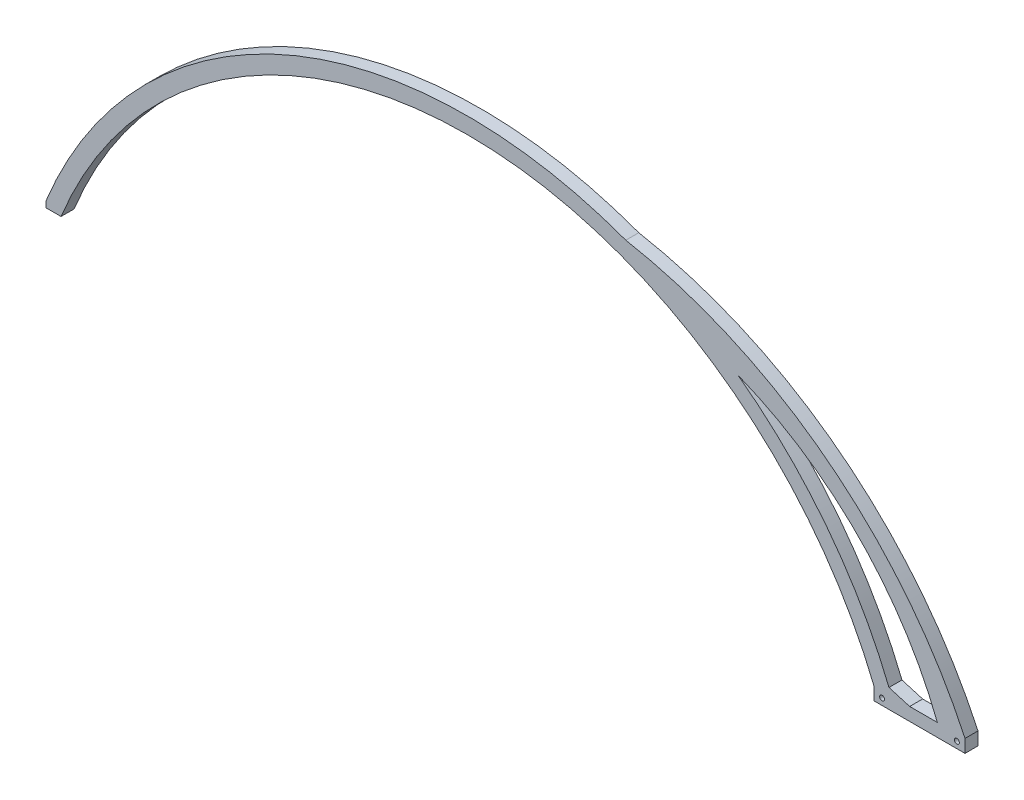
ISO-10303-21;
HEADER;
FILE_DESCRIPTION(('STEP AP214'),'2;1');
FILE_NAME('part.step','',(''),(''),'','','');
FILE_SCHEMA(('AUTOMOTIVE_DESIGN { 1 0 10303 214 1 1 1 1 }'));
ENDSEC;
DATA;
#1=APPLICATION_CONTEXT('core data for automotive mechanical design processes');
#2=APPLICATION_PROTOCOL_DEFINITION('international standard','automotive_design',2000,#1);
#3=PRODUCT_CONTEXT('',#1,'mechanical');
#4=PRODUCT('Part','Part','',(#3));
#5=PRODUCT_RELATED_PRODUCT_CATEGORY('part','',(#4));
#6=PRODUCT_DEFINITION_FORMATION('','',#4);
#7=PRODUCT_DEFINITION_CONTEXT('part definition',#1,'design');
#8=PRODUCT_DEFINITION('design','',#6,#7);
#9=PRODUCT_DEFINITION_SHAPE('','',#8);
#10=(LENGTH_UNIT() NAMED_UNIT(*) SI_UNIT(.MILLI.,.METRE.));
#11=(NAMED_UNIT(*) PLANE_ANGLE_UNIT() SI_UNIT($,.RADIAN.));
#12=(NAMED_UNIT(*) SI_UNIT($,.STERADIAN.) SOLID_ANGLE_UNIT());
#13=UNCERTAINTY_MEASURE_WITH_UNIT(LENGTH_MEASURE(1.E-05),#10,'distance_accuracy_value','');
#14=(GEOMETRIC_REPRESENTATION_CONTEXT(3) GLOBAL_UNCERTAINTY_ASSIGNED_CONTEXT((#13)) GLOBAL_UNIT_ASSIGNED_CONTEXT((#10,
#11,#12)) REPRESENTATION_CONTEXT('',''));
#15=CARTESIAN_POINT('',(0.,0.,0.));
#16=DIRECTION('',(0.,0.,1.));
#17=DIRECTION('',(1.,0.,0.));
#18=AXIS2_PLACEMENT_3D('',#15,#16,#17);
#19=CARTESIAN_POINT('',(-250.320675471821,-101.190708226255,8.));
#20=DIRECTION('',(0.,0.,-1.));
#21=DIRECTION('',(-1.,0.,0.));
#22=AXIS2_PLACEMENT_3D('',#19,#20,#21);
#23=CYLINDRICAL_SURFACE('',#22,280.);
#24=DIRECTION('',(0.,0.,-1.));
#25=VECTOR('',#24,1.);
#26=CARTESIAN_POINT('',(-152.8082424928,161.280862452384,8.));
#27=LINE('',#26,#25);
#28=CARTESIAN_POINT('',(-152.8082424928,161.280862452384,8.));
#29=VERTEX_POINT('',#28);
#30=CARTESIAN_POINT('',(-152.8082424928,161.280862452384,0.));
#31=VERTEX_POINT('',#30);
#32=EDGE_CURVE('E164',#29,#31,#27,.T.);
#33=ORIENTED_EDGE('',*,*,#32,.T.);
#34=CARTESIAN_POINT('',(-250.320675471821,-101.190708226255,0.));
#35=DIRECTION('',(0.,0.,1.));
#36=DIRECTION('',(1.,0.,0.));
#37=AXIS2_PLACEMENT_3D('',#34,#35,#36);
#38=CIRCLE('',#37,280.);
#39=CARTESIAN_POINT('',(-509.912487072229,3.74780400837979,0.));
#40=VERTEX_POINT('',#39);
#41=EDGE_CURVE('E190',#31,#40,#38,.T.);
#42=ORIENTED_EDGE('',*,*,#41,.T.);
#43=DIRECTION('',(0.,0.,-1.));
#44=VECTOR('',#43,1.);
#45=CARTESIAN_POINT('',(-509.912487072229,3.74780400837979,8.));
#46=LINE('',#45,#44);
#47=CARTESIAN_POINT('',(-509.912487072229,3.74780400837979,8.));
#48=VERTEX_POINT('',#47);
#49=EDGE_CURVE('E203',#48,#40,#46,.T.);
#50=ORIENTED_EDGE('',*,*,#49,.F.);
#51=CARTESIAN_POINT('',(-250.320675471821,-101.190708226255,8.));
#52=DIRECTION('',(0.,0.,1.));
#53=DIRECTION('',(1.,0.,0.));
#54=AXIS2_PLACEMENT_3D('',#51,#52,#53);
#55=CIRCLE('',#54,280.);
#56=EDGE_CURVE('E66',#29,#48,#55,.T.);
#57=ORIENTED_EDGE('',*,*,#56,.F.);
#58=EDGE_LOOP('',(#33,#42,#50,#57));
#59=FACE_BOUND('',#58,.T.);
#60=ADVANCED_FACE('F43',(#59),#23,.T.);
#61=CARTESIAN_POINT('',(0.,0.,8.));
#62=DIRECTION('',(0.,0.,1.));
#63=DIRECTION('',(1.,0.,0.));
#64=AXIS2_PLACEMENT_3D('',#61,#62,#63);
#65=PLANE('',#64);
#66=CARTESIAN_POINT('',(-164.11319804853,-78.6214805419995,8.));
#67=DIRECTION('',(0.,0.,-1.));
#68=DIRECTION('',(-1.,0.,0.));
#69=AXIS2_PLACEMENT_3D('',#66,#67,#68);
#70=CIRCLE('',#69,217.852205035375);
#71=CARTESIAN_POINT('',(39.0572871016484,0.,8.));
#72=VERTEX_POINT('',#71);
#73=CARTESIAN_POINT('',(-83.7272781128543,123.857375427877,8.));
#74=VERTEX_POINT('',#73);
#75=EDGE_CURVE('E159',#72,#74,#70,.F.);
#76=ORIENTED_EDGE('',*,*,#75,.F.);
#77=DIRECTION('',(-1.,0.,0.));
#78=VECTOR('',#77,1.);
#79=CARTESIAN_POINT('',(0.,0.,8.));
#80=LINE('',#79,#78);
#81=CARTESIAN_POINT('',(22.0145742032969,0.,8.));
#82=VERTEX_POINT('',#81);
#83=EDGE_CURVE('E58',#72,#82,#80,.T.);
#84=ORIENTED_EDGE('',*,*,#83,.T.);
#85=DIRECTION('',(0.959370922564464,-0.282147891960598,0.));
#86=VECTOR('',#85,1.);
#87=CARTESIAN_POINT('',(9.27113612858599,3.74780400837978,8.));
#88=LINE('',#87,#86);
#89=CARTESIAN_POINT('',(9.27113612858599,3.74780400837978,8.));
#90=VERTEX_POINT('',#89);
#91=EDGE_CURVE('E178',#90,#82,#88,.T.);
#92=ORIENTED_EDGE('',*,*,#91,.F.);
#93=EDGE_CURVE('E175',#90,#74,#55,.T.);
#94=ORIENTED_EDGE('',*,*,#93,.T.);
#95=EDGE_LOOP('',(#76,#84,#92,#94));
#96=FACE_BOUND('',#95,.T.);
#97=CARTESIAN_POINT('',(5.,-4.,8.));
#98=DIRECTION('',(0.,0.,1.));
#99=DIRECTION('',(1.,0.,0.));
#100=AXIS2_PLACEMENT_3D('',#97,#98,#99);
#101=CIRCLE('',#100,1.5);
#102=CARTESIAN_POINT('',(6.5,-4.,8.));
#103=VERTEX_POINT('',#102);
#104=EDGE_CURVE('E213',#103,#103,#101,.T.);
#105=ORIENTED_EDGE('',*,*,#104,.F.);
#106=EDGE_LOOP('',(#105));
#107=FACE_BOUND('',#106,.T.);
#108=DIRECTION('',(0.,-1.,0.));
#109=VECTOR('',#108,1.);
#110=CARTESIAN_POINT('',(0.,0.,8.));
#111=LINE('',#110,#109);
#112=CARTESIAN_POINT('',(0.,0.,8.));
#113=VERTEX_POINT('',#112);
#114=CARTESIAN_POINT('',(0.,-8.,8.));
#115=VERTEX_POINT('',#114);
#116=EDGE_CURVE('E143',#113,#115,#111,.T.);
#117=ORIENTED_EDGE('',*,*,#116,.T.);
#118=DIRECTION('',(1.,0.,0.));
#119=VECTOR('',#118,1.);
#120=CARTESIAN_POINT('',(0.,-8.,8.));
#121=LINE('',#120,#119);
#122=CARTESIAN_POINT('',(56.1,-8.00000000000001,8.));
#123=VERTEX_POINT('',#122);
#124=EDGE_CURVE('E221',#115,#123,#121,.T.);
#125=ORIENTED_EDGE('',*,*,#124,.T.);
#126=DIRECTION('',(0.,1.,0.));
#127=VECTOR('',#126,1.);
#128=CARTESIAN_POINT('',(56.1,0.,8.));
#129=LINE('',#128,#127);
#130=CARTESIAN_POINT('',(56.1,0.,8.));
#131=VERTEX_POINT('',#130);
#132=EDGE_CURVE('E223',#123,#131,#129,.T.);
#133=ORIENTED_EDGE('',*,*,#132,.T.);
#134=CARTESIAN_POINT('',(-204.446472337258,-121.547095781779,8.));
#135=DIRECTION('',(0.,0.,-1.));
#136=DIRECTION('',(-1.,0.,0.));
#137=AXIS2_PLACEMENT_3D('',#134,#135,#136);
#138=CIRCLE('',#137,287.503323007534);
#139=EDGE_CURVE('E152',#131,#29,#138,.F.);
#140=ORIENTED_EDGE('',*,*,#139,.T.);
#141=ORIENTED_EDGE('',*,*,#56,.T.);
#142=DIRECTION('',(0.,1.,0.));
#143=VECTOR('',#142,1.);
#144=CARTESIAN_POINT('',(-509.912487072229,0.,8.));
#145=LINE('',#144,#143);
#146=CARTESIAN_POINT('',(-509.912487072229,0.,8.));
#147=VERTEX_POINT('',#146);
#148=EDGE_CURVE('E171',#147,#48,#145,.T.);
#149=ORIENTED_EDGE('',*,*,#148,.F.);
#150=DIRECTION('',(-1.,0.,0.));
#151=VECTOR('',#150,1.);
#152=CARTESIAN_POINT('',(-500.641350943643,0.,8.));
#153=LINE('',#152,#151);
#154=CARTESIAN_POINT('',(-500.641350943643,0.,8.));
#155=VERTEX_POINT('',#154);
#156=EDGE_CURVE('E168',#155,#147,#153,.T.);
#157=ORIENTED_EDGE('',*,*,#156,.F.);
#158=CARTESIAN_POINT('',(-250.320675471821,-101.190708226255,8.));
#159=DIRECTION('',(0.,0.,1.));
#160=DIRECTION('',(1.,0.,0.));
#161=AXIS2_PLACEMENT_3D('',#158,#159,#160);
#162=CIRCLE('',#161,270.);
#163=EDGE_CURVE('E181',#113,#155,#162,.T.);
#164=ORIENTED_EDGE('',*,*,#163,.F.);
#165=EDGE_LOOP('',(#117,#125,#133,#140,#141,#149,#157,#164));
#166=FACE_BOUND('',#165,.T.);
#167=CARTESIAN_POINT('',(51.1,-3.99999999999999,8.));
#168=DIRECTION('',(0.,0.,1.));
#169=DIRECTION('',(-1.,0.,0.));
#170=AXIS2_PLACEMENT_3D('',#167,#168,#169);
#171=CIRCLE('',#170,1.5);
#172=CARTESIAN_POINT('',(49.6,-3.99999999999999,8.));
#173=VERTEX_POINT('',#172);
#174=EDGE_CURVE('E207',#173,#173,#171,.T.);
#175=ORIENTED_EDGE('',*,*,#174,.F.);
#176=EDGE_LOOP('',(#175));
#177=FACE_BOUND('',#176,.T.);
#178=ADVANCED_FACE('F252',(#96,#107,#166,#177),#65,.T.);
#179=CARTESIAN_POINT('',(0.,0.,0.));
#180=DIRECTION('',(0.,0.,1.));
#181=DIRECTION('',(1.,0.,0.));
#182=AXIS2_PLACEMENT_3D('',#179,#180,#181);
#183=PLANE('',#182);
#184=DIRECTION('',(-1.,0.,0.));
#185=VECTOR('',#184,1.);
#186=CARTESIAN_POINT('',(0.,0.,0.));
#187=LINE('',#186,#185);
#188=CARTESIAN_POINT('',(39.0572871016484,0.,0.));
#189=VERTEX_POINT('',#188);
#190=CARTESIAN_POINT('',(22.0145742032969,0.,0.));
#191=VERTEX_POINT('',#190);
#192=EDGE_CURVE('E134',#189,#191,#187,.T.);
#193=ORIENTED_EDGE('',*,*,#192,.F.);
#194=CARTESIAN_POINT('',(-164.11319804853,-78.6214805419995,0.));
#195=DIRECTION('',(0.,0.,-1.));
#196=DIRECTION('',(-1.,0.,0.));
#197=AXIS2_PLACEMENT_3D('',#194,#195,#196);
#198=CIRCLE('',#197,217.852205035375);
#199=CARTESIAN_POINT('',(-83.7272781128543,123.857375427877,0.));
#200=VERTEX_POINT('',#199);
#201=EDGE_CURVE('E139',#189,#200,#198,.F.);
#202=ORIENTED_EDGE('',*,*,#201,.T.);
#203=CARTESIAN_POINT('',(9.27113612858599,3.74780400837978,0.));
#204=VERTEX_POINT('',#203);
#205=EDGE_CURVE('E191',#204,#200,#38,.T.);
#206=ORIENTED_EDGE('',*,*,#205,.F.);
#207=DIRECTION('',(0.959370922564464,-0.282147891960598,0.));
#208=VECTOR('',#207,1.);
#209=CARTESIAN_POINT('',(9.27113612858599,3.74780400837978,0.));
#210=LINE('',#209,#208);
#211=EDGE_CURVE('E141',#204,#191,#210,.T.);
#212=ORIENTED_EDGE('',*,*,#211,.T.);
#213=EDGE_LOOP('',(#193,#202,#206,#212));
#214=FACE_BOUND('',#213,.T.);
#215=DIRECTION('',(0.,-1.,0.));
#216=VECTOR('',#215,1.);
#217=CARTESIAN_POINT('',(0.,0.,0.));
#218=LINE('',#217,#216);
#219=CARTESIAN_POINT('',(0.,0.,0.));
#220=VERTEX_POINT('',#219);
#221=CARTESIAN_POINT('',(0.,-8.,0.));
#222=VERTEX_POINT('',#221);
#223=EDGE_CURVE('E216',#220,#222,#218,.T.);
#224=ORIENTED_EDGE('',*,*,#223,.F.);
#225=CARTESIAN_POINT('',(-250.320675471821,-101.190708226255,0.));
#226=DIRECTION('',(0.,0.,1.));
#227=DIRECTION('',(1.,0.,0.));
#228=AXIS2_PLACEMENT_3D('',#225,#226,#227);
#229=CIRCLE('',#228,270.);
#230=CARTESIAN_POINT('',(-500.641350943643,0.,0.));
#231=VERTEX_POINT('',#230);
#232=EDGE_CURVE('E172',#220,#231,#229,.T.);
#233=ORIENTED_EDGE('',*,*,#232,.T.);
#234=DIRECTION('',(-1.,0.,0.));
#235=VECTOR('',#234,1.);
#236=CARTESIAN_POINT('',(-500.641350943643,0.,0.));
#237=LINE('',#236,#235);
#238=CARTESIAN_POINT('',(-509.912487072229,0.,0.));
#239=VERTEX_POINT('',#238);
#240=EDGE_CURVE('E166',#231,#239,#237,.T.);
#241=ORIENTED_EDGE('',*,*,#240,.T.);
#242=DIRECTION('',(0.,1.,0.));
#243=VECTOR('',#242,1.);
#244=CARTESIAN_POINT('',(-509.912487072229,0.,0.));
#245=LINE('',#244,#243);
#246=EDGE_CURVE('E187',#239,#40,#245,.T.);
#247=ORIENTED_EDGE('',*,*,#246,.T.);
#248=ORIENTED_EDGE('',*,*,#41,.F.);
#249=CARTESIAN_POINT('',(-204.446472337258,-121.547095781779,0.));
#250=DIRECTION('',(0.,0.,-1.));
#251=DIRECTION('',(-1.,0.,0.));
#252=AXIS2_PLACEMENT_3D('',#249,#250,#251);
#253=CIRCLE('',#252,287.503323007534);
#254=CARTESIAN_POINT('',(56.1,0.,0.));
#255=VERTEX_POINT('',#254);
#256=EDGE_CURVE('E156',#255,#31,#253,.F.);
#257=ORIENTED_EDGE('',*,*,#256,.F.);
#258=DIRECTION('',(0.,1.,0.));
#259=VECTOR('',#258,1.);
#260=CARTESIAN_POINT('',(56.1,0.,0.));
#261=LINE('',#260,#259);
#262=CARTESIAN_POINT('',(56.1,-8.00000000000001,0.));
#263=VERTEX_POINT('',#262);
#264=EDGE_CURVE('E144',#263,#255,#261,.T.);
#265=ORIENTED_EDGE('',*,*,#264,.F.);
#266=DIRECTION('',(1.,0.,0.));
#267=VECTOR('',#266,1.);
#268=CARTESIAN_POINT('',(0.,-8.,0.));
#269=LINE('',#268,#267);
#270=EDGE_CURVE('E229',#222,#263,#269,.T.);
#271=ORIENTED_EDGE('',*,*,#270,.F.);
#272=EDGE_LOOP('',(#224,#233,#241,#247,#248,#257,#265,#271));
#273=FACE_BOUND('',#272,.T.);
#274=CARTESIAN_POINT('',(5.,-4.,0.));
#275=DIRECTION('',(0.,0.,1.));
#276=DIRECTION('',(1.,0.,0.));
#277=AXIS2_PLACEMENT_3D('',#274,#275,#276);
#278=CIRCLE('',#277,1.5);
#279=CARTESIAN_POINT('',(6.5,-4.,0.));
#280=VERTEX_POINT('',#279);
#281=EDGE_CURVE('E210',#280,#280,#278,.T.);
#282=ORIENTED_EDGE('',*,*,#281,.T.);
#283=EDGE_LOOP('',(#282));
#284=FACE_BOUND('',#283,.T.);
#285=CARTESIAN_POINT('',(51.1,-3.99999999999999,0.));
#286=DIRECTION('',(0.,0.,1.));
#287=DIRECTION('',(-1.,0.,0.));
#288=AXIS2_PLACEMENT_3D('',#285,#286,#287);
#289=CIRCLE('',#288,1.5);
#290=CARTESIAN_POINT('',(49.6,-3.99999999999999,0.));
#291=VERTEX_POINT('',#290);
#292=EDGE_CURVE('E198',#291,#291,#289,.T.);
#293=ORIENTED_EDGE('',*,*,#292,.T.);
#294=EDGE_LOOP('',(#293));
#295=FACE_BOUND('',#294,.T.);
#296=ADVANCED_FACE('F135',(#214,#273,#284,#295),#183,.F.);
#297=CARTESIAN_POINT('',(0.,0.,8.));
#298=DIRECTION('',(1.,0.,0.));
#299=DIRECTION('',(0.,1.,0.));
#300=AXIS2_PLACEMENT_3D('',#297,#298,#299);
#301=PLANE('',#300);
#302=ORIENTED_EDGE('',*,*,#223,.T.);
#303=DIRECTION('',(0.,0.,-1.));
#304=VECTOR('',#303,1.);
#305=CARTESIAN_POINT('',(0.,-8.,8.));
#306=LINE('',#305,#304);
#307=EDGE_CURVE('E11',#115,#222,#306,.T.);
#308=ORIENTED_EDGE('',*,*,#307,.F.);
#309=ORIENTED_EDGE('',*,*,#116,.F.);
#310=DIRECTION('',(0.,0.,-1.));
#311=VECTOR('',#310,1.);
#312=CARTESIAN_POINT('',(0.,0.,8.));
#313=LINE('',#312,#311);
#314=EDGE_CURVE('E226',#113,#220,#313,.T.);
#315=ORIENTED_EDGE('',*,*,#314,.T.);
#316=EDGE_LOOP('',(#302,#308,#309,#315));
#317=FACE_BOUND('',#316,.T.);
#318=ADVANCED_FACE('F45',(#317),#301,.F.);
#319=CARTESIAN_POINT('',(0.,-8.,8.));
#320=DIRECTION('',(0.,1.,0.));
#321=DIRECTION('',(-1.,0.,0.));
#322=AXIS2_PLACEMENT_3D('',#319,#320,#321);
#323=PLANE('',#322);
#324=ORIENTED_EDGE('',*,*,#270,.T.);
#325=DIRECTION('',(0.,0.,-1.));
#326=VECTOR('',#325,1.);
#327=CARTESIAN_POINT('',(56.1,-8.00000000000001,8.));
#328=LINE('',#327,#326);
#329=EDGE_CURVE('E51',#123,#263,#328,.T.);
#330=ORIENTED_EDGE('',*,*,#329,.F.);
#331=ORIENTED_EDGE('',*,*,#124,.F.);
#332=ORIENTED_EDGE('',*,*,#307,.T.);
#333=EDGE_LOOP('',(#324,#330,#331,#332));
#334=FACE_BOUND('',#333,.T.);
#335=ADVANCED_FACE('F297',(#334),#323,.F.);
#336=CARTESIAN_POINT('',(56.1,0.,8.));
#337=DIRECTION('',(-1.,0.,0.));
#338=DIRECTION('',(0.,0.,1.));
#339=AXIS2_PLACEMENT_3D('',#336,#337,#338);
#340=PLANE('',#339);
#341=ORIENTED_EDGE('',*,*,#264,.T.);
#342=DIRECTION('',(0.,0.,-1.));
#343=VECTOR('',#342,1.);
#344=CARTESIAN_POINT('',(56.1,0.,8.));
#345=LINE('',#344,#343);
#346=EDGE_CURVE('E234',#131,#255,#345,.T.);
#347=ORIENTED_EDGE('',*,*,#346,.F.);
#348=ORIENTED_EDGE('',*,*,#132,.F.);
#349=ORIENTED_EDGE('',*,*,#329,.T.);
#350=EDGE_LOOP('',(#341,#347,#348,#349));
#351=FACE_BOUND('',#350,.T.);
#352=ADVANCED_FACE('F241',(#351),#340,.F.);
#353=CARTESIAN_POINT('',(0.,0.,8.));
#354=DIRECTION('',(0.,-1.,0.));
#355=DIRECTION('',(1.,0.,0.));
#356=AXIS2_PLACEMENT_3D('',#353,#354,#355);
#357=PLANE('',#356);
#358=ORIENTED_EDGE('',*,*,#83,.F.);
#359=DIRECTION('',(0.,0.,-1.));
#360=VECTOR('',#359,1.);
#361=CARTESIAN_POINT('',(39.0572871016484,0.,8.));
#362=LINE('',#361,#360);
#363=EDGE_CURVE('E146',#72,#189,#362,.T.);
#364=ORIENTED_EDGE('',*,*,#363,.T.);
#365=ORIENTED_EDGE('',*,*,#192,.T.);
#366=DIRECTION('',(0.,0.,-1.));
#367=VECTOR('',#366,1.);
#368=CARTESIAN_POINT('',(22.0145742032969,0.,8.));
#369=LINE('',#368,#367);
#370=EDGE_CURVE('E199',#82,#191,#369,.T.);
#371=ORIENTED_EDGE('',*,*,#370,.F.);
#372=EDGE_LOOP('',(#358,#364,#365,#371));
#373=FACE_BOUND('',#372,.T.);
#374=ADVANCED_FACE('F147',(#373),#357,.F.);
#375=CARTESIAN_POINT('',(5.,-4.,8.));
#376=DIRECTION('',(0.,0.,-1.));
#377=DIRECTION('',(-1.,0.,0.));
#378=AXIS2_PLACEMENT_3D('',#375,#376,#377);
#379=CYLINDRICAL_SURFACE('',#378,1.5);
#380=ORIENTED_EDGE('',*,*,#104,.T.);
#381=EDGE_LOOP('',(#380));
#382=FACE_BOUND('',#381,.T.);
#383=ORIENTED_EDGE('',*,*,#281,.F.);
#384=EDGE_LOOP('',(#383));
#385=FACE_BOUND('',#384,.T.);
#386=ADVANCED_FACE('F287',(#382,#385),#379,.F.);
#387=CARTESIAN_POINT('',(51.1,-3.99999999999999,8.));
#388=DIRECTION('',(0.,0.,-1.));
#389=DIRECTION('',(-1.,0.,0.));
#390=AXIS2_PLACEMENT_3D('',#387,#388,#389);
#391=CYLINDRICAL_SURFACE('',#390,1.5);
#392=ORIENTED_EDGE('',*,*,#174,.T.);
#393=EDGE_LOOP('',(#392));
#394=FACE_BOUND('',#393,.T.);
#395=ORIENTED_EDGE('',*,*,#292,.F.);
#396=EDGE_LOOP('',(#395));
#397=FACE_BOUND('',#396,.T.);
#398=ADVANCED_FACE('F283',(#394,#397),#391,.F.);
#399=CARTESIAN_POINT('',(-500.641350943643,0.,8.));
#400=DIRECTION('',(0.,-1.,0.));
#401=DIRECTION('',(1.,0.,0.));
#402=AXIS2_PLACEMENT_3D('',#399,#400,#401);
#403=PLANE('',#402);
#404=ORIENTED_EDGE('',*,*,#240,.F.);
#405=DIRECTION('',(0.,0.,-1.));
#406=VECTOR('',#405,1.);
#407=CARTESIAN_POINT('',(-500.641350943643,0.,8.));
#408=LINE('',#407,#406);
#409=EDGE_CURVE('E196',#155,#231,#408,.T.);
#410=ORIENTED_EDGE('',*,*,#409,.F.);
#411=ORIENTED_EDGE('',*,*,#156,.T.);
#412=DIRECTION('',(0.,0.,-1.));
#413=VECTOR('',#412,1.);
#414=CARTESIAN_POINT('',(-509.912487072229,0.,8.));
#415=LINE('',#414,#413);
#416=EDGE_CURVE('E184',#147,#239,#415,.T.);
#417=ORIENTED_EDGE('',*,*,#416,.T.);
#418=EDGE_LOOP('',(#404,#410,#411,#417));
#419=FACE_BOUND('',#418,.T.);
#420=ADVANCED_FACE('F270',(#419),#403,.T.);
#421=CARTESIAN_POINT('',(-250.320675471821,-101.190708226255,8.));
#422=DIRECTION('',(0.,0.,-1.));
#423=DIRECTION('',(-1.,0.,0.));
#424=AXIS2_PLACEMENT_3D('',#421,#422,#423);
#425=CYLINDRICAL_SURFACE('',#424,270.);
#426=ORIENTED_EDGE('',*,*,#232,.F.);
#427=ORIENTED_EDGE('',*,*,#314,.F.);
#428=ORIENTED_EDGE('',*,*,#163,.T.);
#429=ORIENTED_EDGE('',*,*,#409,.T.);
#430=EDGE_LOOP('',(#426,#427,#428,#429));
#431=FACE_BOUND('',#430,.T.);
#432=ADVANCED_FACE('F261',(#431),#425,.F.);
#433=CARTESIAN_POINT('',(9.27113612858599,3.74780400837978,8.));
#434=DIRECTION('',(0.282147891960598,0.959370922564464,0.));
#435=DIRECTION('',(-0.959370922564464,0.282147891960598,0.));
#436=AXIS2_PLACEMENT_3D('',#433,#434,#435);
#437=PLANE('',#436);
#438=ORIENTED_EDGE('',*,*,#211,.F.);
#439=DIRECTION('',(0.,0.,-1.));
#440=VECTOR('',#439,1.);
#441=CARTESIAN_POINT('',(9.27113612858599,3.74780400837978,8.));
#442=LINE('',#441,#440);
#443=EDGE_CURVE('E201',#90,#204,#442,.T.);
#444=ORIENTED_EDGE('',*,*,#443,.F.);
#445=ORIENTED_EDGE('',*,*,#91,.T.);
#446=ORIENTED_EDGE('',*,*,#370,.T.);
#447=EDGE_LOOP('',(#438,#444,#445,#446));
#448=FACE_BOUND('',#447,.T.);
#449=ADVANCED_FACE('F259',(#448),#437,.T.);
#450=ORIENTED_EDGE('',*,*,#205,.T.);
#451=DIRECTION('',(0.,0.,-1.));
#452=VECTOR('',#451,1.);
#453=CARTESIAN_POINT('',(-83.7272781128543,123.857375427877,8.));
#454=LINE('',#453,#452);
#455=EDGE_CURVE('E151',#74,#200,#454,.T.);
#456=ORIENTED_EDGE('',*,*,#455,.F.);
#457=ORIENTED_EDGE('',*,*,#93,.F.);
#458=ORIENTED_EDGE('',*,*,#443,.T.);
#459=EDGE_LOOP('',(#450,#456,#457,#458));
#460=FACE_BOUND('',#459,.T.);
#461=ADVANCED_FACE('F257',(#460),#23,.T.);
#462=CARTESIAN_POINT('',(-509.912487072229,0.,8.));
#463=DIRECTION('',(-1.,0.,0.));
#464=DIRECTION('',(0.,0.,1.));
#465=AXIS2_PLACEMENT_3D('',#462,#463,#464);
#466=PLANE('',#465);
#467=ORIENTED_EDGE('',*,*,#246,.F.);
#468=ORIENTED_EDGE('',*,*,#416,.F.);
#469=ORIENTED_EDGE('',*,*,#148,.T.);
#470=ORIENTED_EDGE('',*,*,#49,.T.);
#471=EDGE_LOOP('',(#467,#468,#469,#470));
#472=FACE_BOUND('',#471,.T.);
#473=ADVANCED_FACE('F268',(#472),#466,.T.);
#474=CARTESIAN_POINT('',(-204.446472337258,-121.547095781779,8.));
#475=DIRECTION('',(0.,0.,-1.));
#476=DIRECTION('',(-1.,0.,0.));
#477=AXIS2_PLACEMENT_3D('',#474,#475,#476);
#478=CYLINDRICAL_SURFACE('',#477,287.503323007534);
#479=ORIENTED_EDGE('',*,*,#256,.T.);
#480=ORIENTED_EDGE('',*,*,#32,.F.);
#481=ORIENTED_EDGE('',*,*,#139,.F.);
#482=ORIENTED_EDGE('',*,*,#346,.T.);
#483=EDGE_LOOP('',(#479,#480,#481,#482));
#484=FACE_BOUND('',#483,.T.);
#485=ADVANCED_FACE('F249',(#484),#478,.T.);
#486=CARTESIAN_POINT('',(-164.11319804853,-78.6214805419995,8.));
#487=DIRECTION('',(0.,0.,-1.));
#488=DIRECTION('',(-1.,0.,0.));
#489=AXIS2_PLACEMENT_3D('',#486,#487,#488);
#490=CYLINDRICAL_SURFACE('',#489,217.852205035375);
#491=ORIENTED_EDGE('',*,*,#201,.F.);
#492=ORIENTED_EDGE('',*,*,#363,.F.);
#493=ORIENTED_EDGE('',*,*,#75,.T.);
#494=ORIENTED_EDGE('',*,*,#455,.T.);
#495=EDGE_LOOP('',(#491,#492,#493,#494));
#496=FACE_BOUND('',#495,.T.);
#497=ADVANCED_FACE('F155',(#496),#490,.F.);
#498=CLOSED_SHELL('',(#60,#178,#296,#318,#335,#352,#374,#386,#398,#420,#432,#449,#461,#473,#485,#497));
#499=MANIFOLD_SOLID_BREP('B2',#498);
#500=ADVANCED_BREP_SHAPE_REPRESENTATION('',(#18,#499),#14);
#501=SHAPE_DEFINITION_REPRESENTATION(#9,#500);
ENDSEC;
END-ISO-10303-21;
